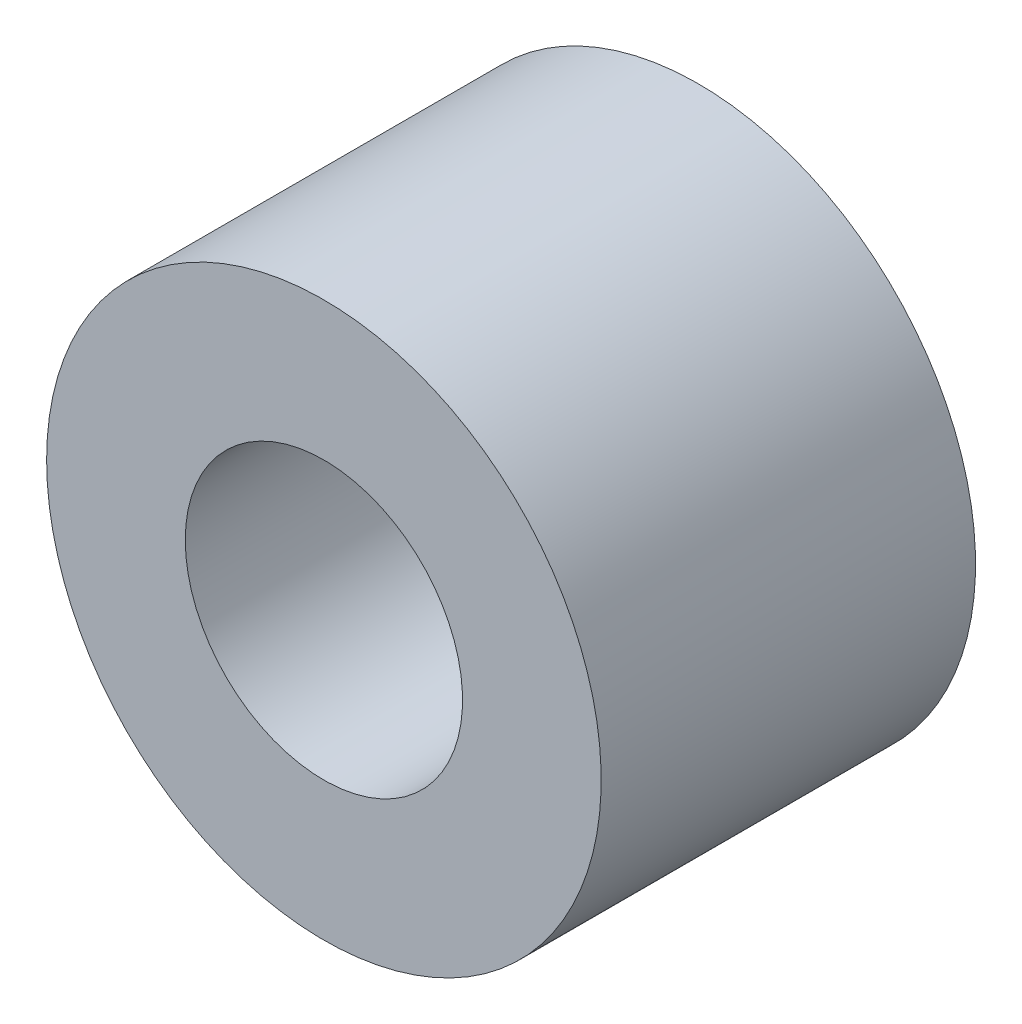
ISO-10303-21;
HEADER;
FILE_DESCRIPTION(('STEP AP214'),'2;1');
FILE_NAME('part.step','',(''),(''),'','','');
FILE_SCHEMA(('AUTOMOTIVE_DESIGN { 1 0 10303 214 1 1 1 1 }'));
ENDSEC;
DATA;
#1=APPLICATION_CONTEXT('core data for automotive mechanical design processes');
#2=APPLICATION_PROTOCOL_DEFINITION('international standard','automotive_design',2000,#1);
#3=PRODUCT_CONTEXT('',#1,'mechanical');
#4=PRODUCT('Part','Part','',(#3));
#5=PRODUCT_RELATED_PRODUCT_CATEGORY('part','',(#4));
#6=PRODUCT_DEFINITION_FORMATION('','',#4);
#7=PRODUCT_DEFINITION_CONTEXT('part definition',#1,'design');
#8=PRODUCT_DEFINITION('design','',#6,#7);
#9=PRODUCT_DEFINITION_SHAPE('','',#8);
#10=(LENGTH_UNIT() NAMED_UNIT(*) SI_UNIT(.MILLI.,.METRE.));
#11=(NAMED_UNIT(*) PLANE_ANGLE_UNIT() SI_UNIT($,.RADIAN.));
#12=(NAMED_UNIT(*) SI_UNIT($,.STERADIAN.) SOLID_ANGLE_UNIT());
#13=UNCERTAINTY_MEASURE_WITH_UNIT(LENGTH_MEASURE(1.E-05),#10,'distance_accuracy_value','');
#14=(GEOMETRIC_REPRESENTATION_CONTEXT(3) GLOBAL_UNCERTAINTY_ASSIGNED_CONTEXT((#13)) GLOBAL_UNIT_ASSIGNED_CONTEXT((#10,
#11,#12)) REPRESENTATION_CONTEXT('',''));
#15=CARTESIAN_POINT('',(0.,0.,0.));
#16=DIRECTION('',(0.,0.,1.));
#17=DIRECTION('',(1.,0.,0.));
#18=AXIS2_PLACEMENT_3D('',#15,#16,#17);
#19=CARTESIAN_POINT('',(0.,0.,2.7));
#20=DIRECTION('',(0.,0.,1.));
#21=DIRECTION('',(1.,0.,0.));
#22=AXIS2_PLACEMENT_3D('',#19,#20,#21);
#23=PLANE('',#22);
#24=CARTESIAN_POINT('',(0.,0.,2.7));
#25=DIRECTION('',(0.,0.,1.));
#26=DIRECTION('',(1.,0.,0.));
#27=AXIS2_PLACEMENT_3D('',#24,#25,#26);
#28=CIRCLE('',#27,2.);
#29=CARTESIAN_POINT('',(-2.,0.,2.7));
#30=VERTEX_POINT('',#29);
#31=EDGE_CURVE('E10',#30,#30,#28,.T.);
#32=ORIENTED_EDGE('',*,*,#31,.T.);
#33=EDGE_LOOP('',(#32));
#34=FACE_BOUND('',#33,.T.);
#35=CARTESIAN_POINT('',(0.,0.,2.7));
#36=DIRECTION('',(0.,0.,1.));
#37=DIRECTION('',(1.,0.,0.));
#38=AXIS2_PLACEMENT_3D('',#35,#36,#37);
#39=CIRCLE('',#38,1.);
#40=CARTESIAN_POINT('',(-1.,0.,2.7));
#41=VERTEX_POINT('',#40);
#42=EDGE_CURVE('E43',#41,#41,#39,.T.);
#43=ORIENTED_EDGE('',*,*,#42,.F.);
#44=EDGE_LOOP('',(#43));
#45=FACE_BOUND('',#44,.T.);
#46=ADVANCED_FACE('F32',(#34,#45),#23,.T.);
#47=CARTESIAN_POINT('',(0.,0.,0.));
#48=DIRECTION('',(0.,0.,1.));
#49=DIRECTION('',(1.,0.,0.));
#50=AXIS2_PLACEMENT_3D('',#47,#48,#49);
#51=PLANE('',#50);
#52=CARTESIAN_POINT('',(0.,0.,0.));
#53=DIRECTION('',(0.,0.,1.));
#54=DIRECTION('',(1.,0.,0.));
#55=AXIS2_PLACEMENT_3D('',#52,#53,#54);
#56=CIRCLE('',#55,2.);
#57=CARTESIAN_POINT('',(-2.,0.,0.));
#58=VERTEX_POINT('',#57);
#59=EDGE_CURVE('E36',#58,#58,#56,.T.);
#60=ORIENTED_EDGE('',*,*,#59,.F.);
#61=EDGE_LOOP('',(#60));
#62=FACE_BOUND('',#61,.T.);
#63=CARTESIAN_POINT('',(0.,0.,0.));
#64=DIRECTION('',(0.,0.,1.));
#65=DIRECTION('',(1.,0.,0.));
#66=AXIS2_PLACEMENT_3D('',#63,#64,#65);
#67=CIRCLE('',#66,1.);
#68=CARTESIAN_POINT('',(-1.,0.,0.));
#69=VERTEX_POINT('',#68);
#70=EDGE_CURVE('E45',#69,#69,#67,.T.);
#71=ORIENTED_EDGE('',*,*,#70,.T.);
#72=EDGE_LOOP('',(#71));
#73=FACE_BOUND('',#72,.T.);
#74=ADVANCED_FACE('F55',(#62,#73),#51,.F.);
#75=CARTESIAN_POINT('',(0.,0.,2.7));
#76=DIRECTION('',(0.,0.,-1.));
#77=DIRECTION('',(-1.,0.,0.));
#78=AXIS2_PLACEMENT_3D('',#75,#76,#77);
#79=CYLINDRICAL_SURFACE('',#78,2.);
#80=CARTESIAN_POINT('',(-2.,0.,2.7));
#81=CARTESIAN_POINT('',(-2.,0.,2.671875));
#82=CARTESIAN_POINT('',(-2.,0.,2.64375));
#83=CARTESIAN_POINT('',(-2.,0.,2.5875));
#84=CARTESIAN_POINT('',(-2.,0.,2.559375));
#85=CARTESIAN_POINT('',(-2.,0.,2.503125));
#86=CARTESIAN_POINT('',(-2.,0.,2.475));
#87=CARTESIAN_POINT('',(-2.,0.,2.41875));
#88=CARTESIAN_POINT('',(-2.,0.,2.390625));
#89=CARTESIAN_POINT('',(-2.,0.,2.334375));
#90=CARTESIAN_POINT('',(-2.,0.,2.30625));
#91=CARTESIAN_POINT('',(-2.,0.,2.25));
#92=CARTESIAN_POINT('',(-2.,0.,2.221875));
#93=CARTESIAN_POINT('',(-2.,0.,2.165625));
#94=CARTESIAN_POINT('',(-2.,0.,2.1375));
#95=CARTESIAN_POINT('',(-2.,0.,2.08125));
#96=CARTESIAN_POINT('',(-2.,0.,2.053125));
#97=CARTESIAN_POINT('',(-2.,0.,1.996875));
#98=CARTESIAN_POINT('',(-2.,0.,1.96875));
#99=CARTESIAN_POINT('',(-2.,0.,1.9125));
#100=CARTESIAN_POINT('',(-2.,0.,1.884375));
#101=CARTESIAN_POINT('',(-2.,0.,1.828125));
#102=CARTESIAN_POINT('',(-2.,0.,1.8));
#103=CARTESIAN_POINT('',(-2.,0.,1.74375));
#104=CARTESIAN_POINT('',(-2.,0.,1.715625));
#105=CARTESIAN_POINT('',(-2.,0.,1.659375));
#106=CARTESIAN_POINT('',(-2.,0.,1.63125));
#107=CARTESIAN_POINT('',(-2.,0.,1.575));
#108=CARTESIAN_POINT('',(-2.,0.,1.546875));
#109=CARTESIAN_POINT('',(-2.,0.,1.490625));
#110=CARTESIAN_POINT('',(-2.,0.,1.4625));
#111=CARTESIAN_POINT('',(-2.,0.,1.40625));
#112=CARTESIAN_POINT('',(-2.,0.,1.378125));
#113=CARTESIAN_POINT('',(-2.,0.,1.321875));
#114=CARTESIAN_POINT('',(-2.,0.,1.29375));
#115=CARTESIAN_POINT('',(-2.,0.,1.2375));
#116=CARTESIAN_POINT('',(-2.,0.,1.209375));
#117=CARTESIAN_POINT('',(-2.,0.,1.153125));
#118=CARTESIAN_POINT('',(-2.,0.,1.125));
#119=CARTESIAN_POINT('',(-2.,0.,1.06875));
#120=CARTESIAN_POINT('',(-2.,0.,1.040625));
#121=CARTESIAN_POINT('',(-2.,0.,0.984375));
#122=CARTESIAN_POINT('',(-2.,0.,0.956249999999999));
#123=CARTESIAN_POINT('',(-2.,0.,0.899999999999999));
#124=CARTESIAN_POINT('',(-2.,0.,0.871875));
#125=CARTESIAN_POINT('',(-2.,0.,0.815624999999999));
#126=CARTESIAN_POINT('',(-2.,0.,0.787499999999999));
#127=CARTESIAN_POINT('',(-2.,0.,0.73125));
#128=CARTESIAN_POINT('',(-2.,0.,0.703125));
#129=CARTESIAN_POINT('',(-2.,0.,0.646875));
#130=CARTESIAN_POINT('',(-2.,0.,0.61875));
#131=CARTESIAN_POINT('',(-2.,0.,0.5625));
#132=CARTESIAN_POINT('',(-2.,0.,0.534375));
#133=CARTESIAN_POINT('',(-2.,0.,0.478125));
#134=CARTESIAN_POINT('',(-2.,0.,0.45));
#135=CARTESIAN_POINT('',(-2.,0.,0.39375));
#136=CARTESIAN_POINT('',(-2.,0.,0.365625));
#137=CARTESIAN_POINT('',(-2.,0.,0.309375));
#138=CARTESIAN_POINT('',(-2.,0.,0.28125));
#139=CARTESIAN_POINT('',(-2.,0.,0.225));
#140=CARTESIAN_POINT('',(-2.,0.,0.196875));
#141=CARTESIAN_POINT('',(-2.,0.,0.140625));
#142=CARTESIAN_POINT('',(-2.,0.,0.1125));
#143=CARTESIAN_POINT('',(-2.,0.,0.0562499999999997));
#144=CARTESIAN_POINT('',(-2.,0.,0.0281249999999996));
#145=CARTESIAN_POINT('',(-2.,0.,0.));
#146=B_SPLINE_CURVE_WITH_KNOTS('',3,(#80,#81,#82,#83,#84,#85,#86,#87,#88,#89,#90,#91,#92,#93,
#94,#95,#96,#97,#98,#99,#100,#101,#102,#103,#104,#105,#106,#107,#108,#109,#110,#111,#112,#113,
#114,#115,#116,#117,#118,#119,#120,#121,#122,#123,#124,#125,#126,#127,#128,#129,#130,#131,#132,
#133,#134,#135,#136,#137,#138,#139,#140,#141,#142,#143,#144,#145),.UNSPECIFIED.,.F.,.F.,(4,2,2,
2,2,2,2,2,2,2,2,2,2,2,2,2,2,2,2,2,2,2,2,2,2,2,2,2,2,2,2,2,4),(0.,0.0843750000000003,0.16875,
0.253125,0.3375,0.421875,0.50625,0.590625,0.675,0.759375,0.84375,0.928125000000001,1.0125,
1.096875,1.18125,1.265625,1.35,1.434375,1.51875,1.603125,1.6875,1.771875,1.85625,1.940625,2.025,
2.109375,2.19375,2.278125,2.3625,2.446875,2.53125,2.615625,2.7),.UNSPECIFIED.);
#147=EDGE_CURVE('BSEAM34',#30,#58,#146,.T.);
#148=ORIENTED_EDGE('',*,*,#31,.F.);
#149=ORIENTED_EDGE('',*,*,#59,.T.);
#150=ORIENTED_EDGE('',*,*,#147,.T.);
#151=ORIENTED_EDGE('',*,*,#147,.F.);
#152=EDGE_LOOP('',(#148,#150,#149,#151));
#153=FACE_BOUND('',#152,.T.);
#154=ADVANCED_FACE('F34',(#153),#79,.T.);
#155=CARTESIAN_POINT('',(0.,0.,2.7));
#156=DIRECTION('',(0.,0.,-1.));
#157=DIRECTION('',(-1.,0.,0.));
#158=AXIS2_PLACEMENT_3D('',#155,#156,#157);
#159=CYLINDRICAL_SURFACE('',#158,1.);
#160=CARTESIAN_POINT('',(-1.,0.,2.7));
#161=CARTESIAN_POINT('',(-1.,0.,2.671875));
#162=CARTESIAN_POINT('',(-1.,0.,2.64375));
#163=CARTESIAN_POINT('',(-1.,0.,2.5875));
#164=CARTESIAN_POINT('',(-1.,0.,2.559375));
#165=CARTESIAN_POINT('',(-1.,0.,2.503125));
#166=CARTESIAN_POINT('',(-1.,0.,2.475));
#167=CARTESIAN_POINT('',(-1.,0.,2.41875));
#168=CARTESIAN_POINT('',(-1.,0.,2.390625));
#169=CARTESIAN_POINT('',(-1.,0.,2.334375));
#170=CARTESIAN_POINT('',(-1.,0.,2.30625));
#171=CARTESIAN_POINT('',(-1.,0.,2.25));
#172=CARTESIAN_POINT('',(-1.,0.,2.221875));
#173=CARTESIAN_POINT('',(-1.,0.,2.165625));
#174=CARTESIAN_POINT('',(-1.,0.,2.1375));
#175=CARTESIAN_POINT('',(-1.,0.,2.08125));
#176=CARTESIAN_POINT('',(-1.,0.,2.053125));
#177=CARTESIAN_POINT('',(-1.,0.,1.996875));
#178=CARTESIAN_POINT('',(-1.,0.,1.96875));
#179=CARTESIAN_POINT('',(-1.,0.,1.9125));
#180=CARTESIAN_POINT('',(-1.,0.,1.884375));
#181=CARTESIAN_POINT('',(-1.,0.,1.828125));
#182=CARTESIAN_POINT('',(-1.,0.,1.8));
#183=CARTESIAN_POINT('',(-1.,0.,1.74375));
#184=CARTESIAN_POINT('',(-1.,0.,1.715625));
#185=CARTESIAN_POINT('',(-1.,0.,1.659375));
#186=CARTESIAN_POINT('',(-1.,0.,1.63125));
#187=CARTESIAN_POINT('',(-1.,0.,1.575));
#188=CARTESIAN_POINT('',(-1.,0.,1.546875));
#189=CARTESIAN_POINT('',(-1.,0.,1.490625));
#190=CARTESIAN_POINT('',(-1.,0.,1.4625));
#191=CARTESIAN_POINT('',(-1.,0.,1.40625));
#192=CARTESIAN_POINT('',(-1.,0.,1.378125));
#193=CARTESIAN_POINT('',(-1.,0.,1.321875));
#194=CARTESIAN_POINT('',(-1.,0.,1.29375));
#195=CARTESIAN_POINT('',(-1.,0.,1.2375));
#196=CARTESIAN_POINT('',(-1.,0.,1.209375));
#197=CARTESIAN_POINT('',(-1.,0.,1.153125));
#198=CARTESIAN_POINT('',(-1.,0.,1.125));
#199=CARTESIAN_POINT('',(-1.,0.,1.06875));
#200=CARTESIAN_POINT('',(-1.,0.,1.040625));
#201=CARTESIAN_POINT('',(-1.,0.,0.984375));
#202=CARTESIAN_POINT('',(-1.,0.,0.95625));
#203=CARTESIAN_POINT('',(-1.,0.,0.9));
#204=CARTESIAN_POINT('',(-1.,0.,0.871875));
#205=CARTESIAN_POINT('',(-1.,0.,0.815625));
#206=CARTESIAN_POINT('',(-1.,0.,0.7875));
#207=CARTESIAN_POINT('',(-1.,0.,0.73125));
#208=CARTESIAN_POINT('',(-1.,0.,0.703125));
#209=CARTESIAN_POINT('',(-1.,0.,0.646875));
#210=CARTESIAN_POINT('',(-1.,0.,0.61875));
#211=CARTESIAN_POINT('',(-1.,0.,0.5625));
#212=CARTESIAN_POINT('',(-1.,0.,0.534375));
#213=CARTESIAN_POINT('',(-1.,0.,0.478125));
#214=CARTESIAN_POINT('',(-1.,0.,0.45));
#215=CARTESIAN_POINT('',(-1.,0.,0.39375));
#216=CARTESIAN_POINT('',(-1.,0.,0.365625));
#217=CARTESIAN_POINT('',(-1.,0.,0.309375));
#218=CARTESIAN_POINT('',(-1.,0.,0.28125));
#219=CARTESIAN_POINT('',(-1.,0.,0.225));
#220=CARTESIAN_POINT('',(-1.,0.,0.196875));
#221=CARTESIAN_POINT('',(-1.,0.,0.140625));
#222=CARTESIAN_POINT('',(-1.,0.,0.112499999999999));
#223=CARTESIAN_POINT('',(-1.,0.,0.0562499999999994));
#224=CARTESIAN_POINT('',(-1.,0.,0.0281249999999995));
#225=CARTESIAN_POINT('',(-1.,0.,0.));
#226=B_SPLINE_CURVE_WITH_KNOTS('',3,(#160,#161,#162,#163,#164,#165,#166,#167,#168,#169,#170,
#171,#172,#173,#174,#175,#176,#177,#178,#179,#180,#181,#182,#183,#184,#185,#186,#187,#188,#189,
#190,#191,#192,#193,#194,#195,#196,#197,#198,#199,#200,#201,#202,#203,#204,#205,#206,#207,#208,
#209,#210,#211,#212,#213,#214,#215,#216,#217,#218,#219,#220,#221,#222,#223,#224,#225),
.UNSPECIFIED.,.F.,.F.,(4,2,2,2,2,2,2,2,2,2,2,2,2,2,2,2,2,2,2,2,2,2,2,2,2,2,2,2,2,2,2,2,4),(0.,
0.0843749999999998,0.16875,0.253125,0.3375,0.421875,0.50625,0.590625,0.675,0.759375,0.84375,
0.928125,1.0125,1.096875,1.18125,1.265625,1.35,1.434375,1.51875,1.603125,1.6875,1.771875,
1.85625,1.940625,2.025,2.109375,2.19375,2.278125,2.3625,2.446875,2.53125,2.615625,2.7),.UNSPECIFIED.);
#227=EDGE_CURVE('BSEAM51',#41,#69,#226,.T.);
#228=ORIENTED_EDGE('',*,*,#42,.T.);
#229=ORIENTED_EDGE('',*,*,#70,.F.);
#230=ORIENTED_EDGE('',*,*,#227,.T.);
#231=ORIENTED_EDGE('',*,*,#227,.F.);
#232=EDGE_LOOP('',(#228,#230,#229,#231));
#233=FACE_BOUND('',#232,.T.);
#234=ADVANCED_FACE('F51',(#233),#159,.F.);
#235=CLOSED_SHELL('',(#46,#74,#154,#234));
#236=MANIFOLD_SOLID_BREP('B2',#235);
#237=ADVANCED_BREP_SHAPE_REPRESENTATION('',(#18,#236),#14);
#238=SHAPE_DEFINITION_REPRESENTATION(#9,#237);
ENDSEC;
END-ISO-10303-21;
